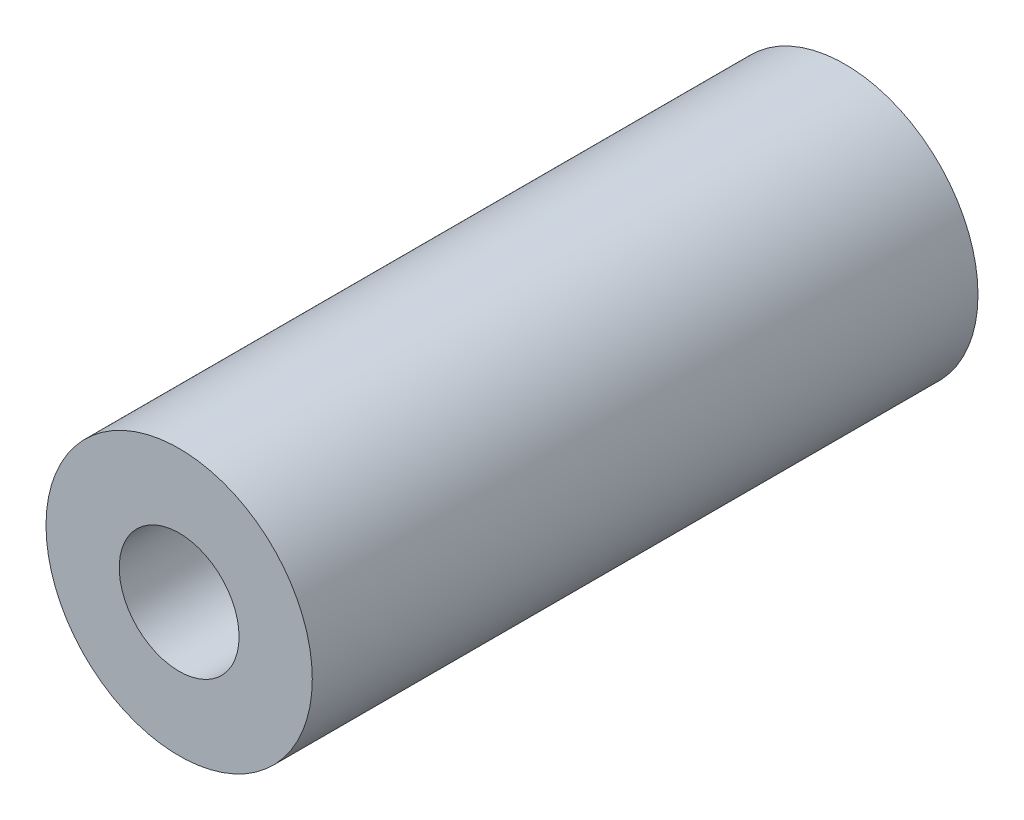
ISO-10303-21;
HEADER;
FILE_DESCRIPTION(('STEP AP214'),'2;1');
FILE_NAME('part.step','',(''),(''),'','','');
FILE_SCHEMA(('AUTOMOTIVE_DESIGN { 1 0 10303 214 1 1 1 1 }'));
ENDSEC;
DATA;
#1=APPLICATION_CONTEXT('core data for automotive mechanical design processes');
#2=APPLICATION_PROTOCOL_DEFINITION('international standard','automotive_design',2000,#1);
#3=PRODUCT_CONTEXT('',#1,'mechanical');
#4=PRODUCT('Part','Part','',(#3));
#5=PRODUCT_RELATED_PRODUCT_CATEGORY('part','',(#4));
#6=PRODUCT_DEFINITION_FORMATION('','',#4);
#7=PRODUCT_DEFINITION_CONTEXT('part definition',#1,'design');
#8=PRODUCT_DEFINITION('design','',#6,#7);
#9=PRODUCT_DEFINITION_SHAPE('','',#8);
#10=(LENGTH_UNIT() NAMED_UNIT(*) SI_UNIT(.MILLI.,.METRE.));
#11=(NAMED_UNIT(*) PLANE_ANGLE_UNIT() SI_UNIT($,.RADIAN.));
#12=(NAMED_UNIT(*) SI_UNIT($,.STERADIAN.) SOLID_ANGLE_UNIT());
#13=UNCERTAINTY_MEASURE_WITH_UNIT(LENGTH_MEASURE(1.E-05),#10,'distance_accuracy_value','');
#14=(GEOMETRIC_REPRESENTATION_CONTEXT(3) GLOBAL_UNCERTAINTY_ASSIGNED_CONTEXT((#13)) GLOBAL_UNIT_ASSIGNED_CONTEXT((#10,
#11,#12)) REPRESENTATION_CONTEXT('',''));
#15=CARTESIAN_POINT('',(0.,0.,0.));
#16=DIRECTION('',(0.,0.,1.));
#17=DIRECTION('',(1.,0.,0.));
#18=AXIS2_PLACEMENT_3D('',#15,#16,#17);
#19=CARTESIAN_POINT('',(205.348971612439,114.766543298255,-156.568542494923));
#20=DIRECTION('',(0.,0.,1.));
#21=DIRECTION('',(1.,0.,0.));
#22=AXIS2_PLACEMENT_3D('',#19,#20,#21);
#23=CYLINDRICAL_SURFACE('',#22,20.);
#24=CARTESIAN_POINT('',(205.348971612439,114.766543298255,-99.9999999999989));
#25=DIRECTION('',(0.,0.,1.));
#26=DIRECTION('',(1.,0.,0.));
#27=AXIS2_PLACEMENT_3D('',#24,#25,#26);
#28=CIRCLE('',#27,20.);
#29=CARTESIAN_POINT('',(225.348971612439,114.766543298255,-99.9999999999989));
#30=VERTEX_POINT('',#29);
#31=EDGE_CURVE('E10',#30,#30,#28,.F.);
#32=ORIENTED_EDGE('',*,*,#31,.F.);
#33=EDGE_LOOP('',(#32));
#34=FACE_BOUND('',#33,.T.);
#35=CARTESIAN_POINT('',(205.348971612439,114.766543298255,0.));
#36=DIRECTION('',(0.,0.,1.));
#37=DIRECTION('',(1.,0.,0.));
#38=AXIS2_PLACEMENT_3D('',#35,#36,#37);
#39=CIRCLE('',#38,20.);
#40=CARTESIAN_POINT('',(225.348971612439,114.766543298255,0.));
#41=VERTEX_POINT('',#40);
#42=EDGE_CURVE('E48',#41,#41,#39,.T.);
#43=ORIENTED_EDGE('',*,*,#42,.F.);
#44=EDGE_LOOP('',(#43));
#45=FACE_BOUND('',#44,.T.);
#46=ADVANCED_FACE('F37',(#34,#45),#23,.T.);
#47=CARTESIAN_POINT('',(205.348971612439,114.766543298255,0.));
#48=DIRECTION('',(0.,0.,1.));
#49=DIRECTION('',(1.,0.,0.));
#50=AXIS2_PLACEMENT_3D('',#47,#48,#49);
#51=PLANE('',#50);
#52=CARTESIAN_POINT('',(205.348971612439,114.766543298255,0.));
#53=DIRECTION('',(0.,0.,1.));
#54=DIRECTION('',(1.,0.,0.));
#55=AXIS2_PLACEMENT_3D('',#52,#53,#54);
#56=CIRCLE('',#55,9.00000000000001);
#57=CARTESIAN_POINT('',(214.348971612439,114.766543298255,0.));
#58=VERTEX_POINT('',#57);
#59=EDGE_CURVE('E50',#58,#58,#56,.T.);
#60=ORIENTED_EDGE('',*,*,#59,.F.);
#61=EDGE_LOOP('',(#60));
#62=FACE_BOUND('',#61,.T.);
#63=ORIENTED_EDGE('',*,*,#42,.T.);
#64=EDGE_LOOP('',(#63));
#65=FACE_BOUND('',#64,.T.);
#66=ADVANCED_FACE('F55',(#62,#65),#51,.T.);
#67=CARTESIAN_POINT('',(205.348971612439,114.766543298255,-156.568542494923));
#68=DIRECTION('',(0.,0.,1.));
#69=DIRECTION('',(1.,0.,0.));
#70=AXIS2_PLACEMENT_3D('',#67,#68,#69);
#71=CYLINDRICAL_SURFACE('',#70,9.00000000000001);
#72=CARTESIAN_POINT('',(205.348971612439,114.766543298255,-99.9999999999989));
#73=DIRECTION('',(0.,0.,1.));
#74=DIRECTION('',(1.,0.,0.));
#75=AXIS2_PLACEMENT_3D('',#72,#73,#74);
#76=CIRCLE('',#75,9.00000000000001);
#77=CARTESIAN_POINT('',(214.348971612439,114.766543298255,-99.9999999999989));
#78=VERTEX_POINT('',#77);
#79=EDGE_CURVE('E40',#78,#78,#76,.F.);
#80=ORIENTED_EDGE('',*,*,#79,.T.);
#81=EDGE_LOOP('',(#80));
#82=FACE_BOUND('',#81,.T.);
#83=ORIENTED_EDGE('',*,*,#59,.T.);
#84=EDGE_LOOP('',(#83));
#85=FACE_BOUND('',#84,.T.);
#86=ADVANCED_FACE('F62',(#82,#85),#71,.F.);
#87=CARTESIAN_POINT('',(167.8165689546,196.506097661504,-99.9999999999989));
#88=DIRECTION('',(0.,0.,1.));
#89=DIRECTION('',(-0.523454258952533,-0.852053776932216,0.));
#90=AXIS2_PLACEMENT_3D('',#87,#88,#89);
#91=PLANE('',#90);
#92=ORIENTED_EDGE('',*,*,#31,.T.);
#93=EDGE_LOOP('',(#92));
#94=FACE_BOUND('',#93,.T.);
#95=ORIENTED_EDGE('',*,*,#79,.F.);
#96=EDGE_LOOP('',(#95));
#97=FACE_BOUND('',#96,.T.);
#98=ADVANCED_FACE('F67',(#94,#97),#91,.F.);
#99=CLOSED_SHELL('',(#46,#66,#86,#98));
#100=MANIFOLD_SOLID_BREP('B2',#99);
#101=ADVANCED_BREP_SHAPE_REPRESENTATION('',(#18,#100),#14);
#102=SHAPE_DEFINITION_REPRESENTATION(#9,#101);
ENDSEC;
END-ISO-10303-21;
